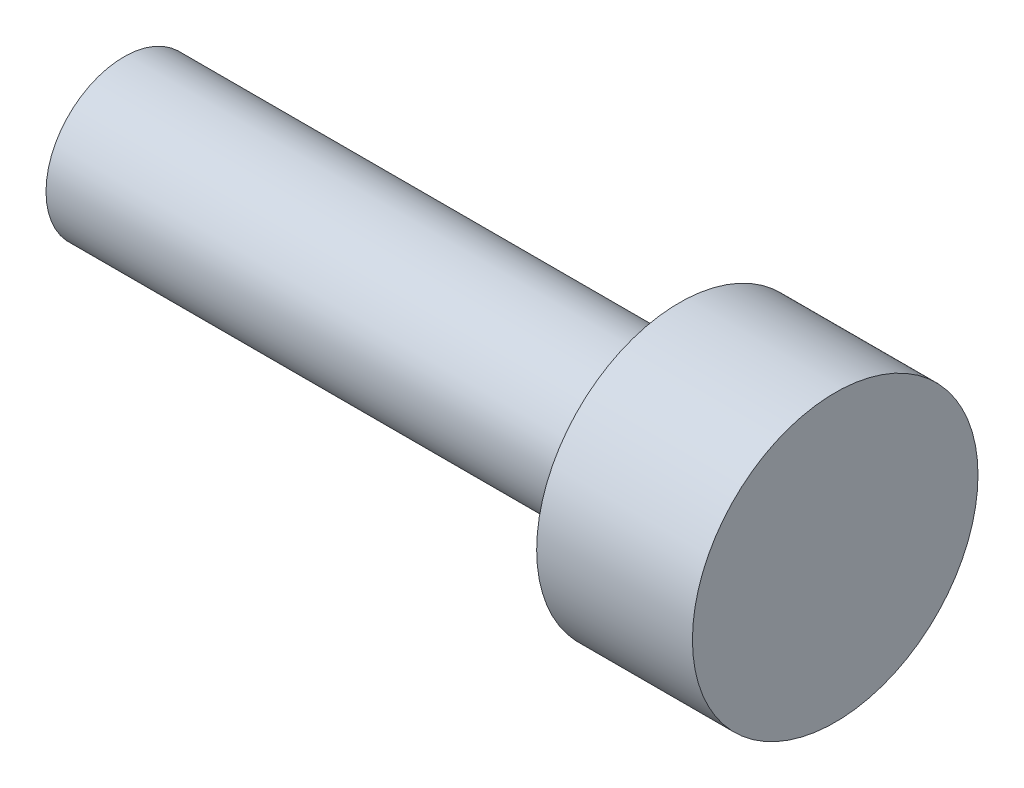
ISO-10303-21;
HEADER;
FILE_DESCRIPTION(('STEP AP214'),'2;1');
FILE_NAME('part.step','',(''),(''),'','','');
FILE_SCHEMA(('AUTOMOTIVE_DESIGN { 1 0 10303 214 1 1 1 1 }'));
ENDSEC;
DATA;
#1=APPLICATION_CONTEXT('core data for automotive mechanical design processes');
#2=APPLICATION_PROTOCOL_DEFINITION('international standard','automotive_design',2000,#1);
#3=PRODUCT_CONTEXT('',#1,'mechanical');
#4=PRODUCT('Part','Part','',(#3));
#5=PRODUCT_RELATED_PRODUCT_CATEGORY('part','',(#4));
#6=PRODUCT_DEFINITION_FORMATION('','',#4);
#7=PRODUCT_DEFINITION_CONTEXT('part definition',#1,'design');
#8=PRODUCT_DEFINITION('design','',#6,#7);
#9=PRODUCT_DEFINITION_SHAPE('','',#8);
#10=(LENGTH_UNIT() NAMED_UNIT(*) SI_UNIT(.MILLI.,.METRE.));
#11=(NAMED_UNIT(*) PLANE_ANGLE_UNIT() SI_UNIT($,.RADIAN.));
#12=(NAMED_UNIT(*) SI_UNIT($,.STERADIAN.) SOLID_ANGLE_UNIT());
#13=UNCERTAINTY_MEASURE_WITH_UNIT(LENGTH_MEASURE(1.E-05),#10,'distance_accuracy_value','');
#14=(GEOMETRIC_REPRESENTATION_CONTEXT(3) GLOBAL_UNCERTAINTY_ASSIGNED_CONTEXT((#13)) GLOBAL_UNIT_ASSIGNED_CONTEXT((#10,
#11,#12)) REPRESENTATION_CONTEXT('',''));
#15=CARTESIAN_POINT('',(0.,0.,0.));
#16=DIRECTION('',(0.,0.,1.));
#17=DIRECTION('',(1.,0.,0.));
#18=AXIS2_PLACEMENT_3D('',#15,#16,#17);
#19=CARTESIAN_POINT('',(132.,1.5,0.));
#20=DIRECTION('',(1.,0.,0.));
#21=DIRECTION('',(0.,0.,-1.));
#22=AXIS2_PLACEMENT_3D('',#19,#20,#21);
#23=PLANE('',#22);
#24=CARTESIAN_POINT('',(132.,0.,0.));
#25=DIRECTION('',(-1.,0.,0.));
#26=DIRECTION('',(0.,0.,1.));
#27=AXIS2_PLACEMENT_3D('',#24,#25,#26);
#28=CIRCLE('',#27,1.5);
#29=CARTESIAN_POINT('',(132.,0.,1.5));
#30=VERTEX_POINT('',#29);
#31=EDGE_CURVE('E45',#30,#30,#28,.T.);
#32=ORIENTED_EDGE('',*,*,#31,.T.);
#33=EDGE_LOOP('',(#32));
#34=FACE_BOUND('',#33,.T.);
#35=ADVANCED_FACE('F31',(#34),#23,.F.);
#36=CARTESIAN_POINT('',(145.7,0.,0.));
#37=DIRECTION('',(-1.,0.,0.));
#38=DIRECTION('',(0.,0.,1.));
#39=AXIS2_PLACEMENT_3D('',#36,#37,#38);
#40=PLANE('',#39);
#41=CARTESIAN_POINT('',(145.7,0.,0.));
#42=DIRECTION('',(-1.,0.,0.));
#43=DIRECTION('',(0.,0.,1.));
#44=AXIS2_PLACEMENT_3D('',#41,#42,#43);
#45=CIRCLE('',#44,2.75);
#46=CARTESIAN_POINT('',(145.7,0.,2.75));
#47=VERTEX_POINT('',#46);
#48=EDGE_CURVE('E10',#47,#47,#45,.T.);
#49=ORIENTED_EDGE('',*,*,#48,.F.);
#50=EDGE_LOOP('',(#49));
#51=FACE_BOUND('',#50,.T.);
#52=ADVANCED_FACE('F65',(#51),#40,.F.);
#53=CARTESIAN_POINT('',(-110.,0.,0.));
#54=DIRECTION('',(-1.,0.,0.));
#55=DIRECTION('',(0.,0.,1.));
#56=AXIS2_PLACEMENT_3D('',#53,#54,#55);
#57=CYLINDRICAL_SURFACE('',#56,2.75);
#58=CARTESIAN_POINT('',(142.7,0.,0.));
#59=DIRECTION('',(-1.,0.,0.));
#60=DIRECTION('',(0.,0.,1.));
#61=AXIS2_PLACEMENT_3D('',#58,#59,#60);
#62=CIRCLE('',#61,2.75);
#63=CARTESIAN_POINT('',(142.7,0.,2.75));
#64=VERTEX_POINT('',#63);
#65=EDGE_CURVE('E37',#64,#64,#62,.T.);
#66=ORIENTED_EDGE('',*,*,#65,.F.);
#67=EDGE_LOOP('',(#66));
#68=FACE_BOUND('',#67,.T.);
#69=ORIENTED_EDGE('',*,*,#48,.T.);
#70=EDGE_LOOP('',(#69));
#71=FACE_BOUND('',#70,.T.);
#72=ADVANCED_FACE('F60',(#68,#71),#57,.T.);
#73=CARTESIAN_POINT('',(142.7,2.75,0.));
#74=DIRECTION('',(1.,0.,0.));
#75=DIRECTION('',(0.,0.,-1.));
#76=AXIS2_PLACEMENT_3D('',#73,#74,#75);
#77=PLANE('',#76);
#78=CARTESIAN_POINT('',(142.7,0.,0.));
#79=DIRECTION('',(-1.,0.,0.));
#80=DIRECTION('',(0.,0.,1.));
#81=AXIS2_PLACEMENT_3D('',#78,#79,#80);
#82=CIRCLE('',#81,1.5);
#83=CARTESIAN_POINT('',(142.7,0.,1.5));
#84=VERTEX_POINT('',#83);
#85=EDGE_CURVE('E41',#84,#84,#82,.T.);
#86=ORIENTED_EDGE('',*,*,#85,.F.);
#87=EDGE_LOOP('',(#86));
#88=FACE_BOUND('',#87,.T.);
#89=ORIENTED_EDGE('',*,*,#65,.T.);
#90=EDGE_LOOP('',(#89));
#91=FACE_BOUND('',#90,.T.);
#92=ADVANCED_FACE('F55',(#88,#91),#77,.F.);
#93=CARTESIAN_POINT('',(-110.,0.,0.));
#94=DIRECTION('',(-1.,0.,0.));
#95=DIRECTION('',(0.,0.,1.));
#96=AXIS2_PLACEMENT_3D('',#93,#94,#95);
#97=CYLINDRICAL_SURFACE('',#96,1.5);
#98=ORIENTED_EDGE('',*,*,#31,.F.);
#99=EDGE_LOOP('',(#98));
#100=FACE_BOUND('',#99,.T.);
#101=ORIENTED_EDGE('',*,*,#85,.T.);
#102=EDGE_LOOP('',(#101));
#103=FACE_BOUND('',#102,.T.);
#104=ADVANCED_FACE('F52',(#100,#103),#97,.T.);
#105=CLOSED_SHELL('',(#35,#52,#72,#92,#104));
#106=MANIFOLD_SOLID_BREP('B2',#105);
#107=ADVANCED_BREP_SHAPE_REPRESENTATION('',(#18,#106),#14);
#108=SHAPE_DEFINITION_REPRESENTATION(#9,#107);
ENDSEC;
END-ISO-10303-21;
